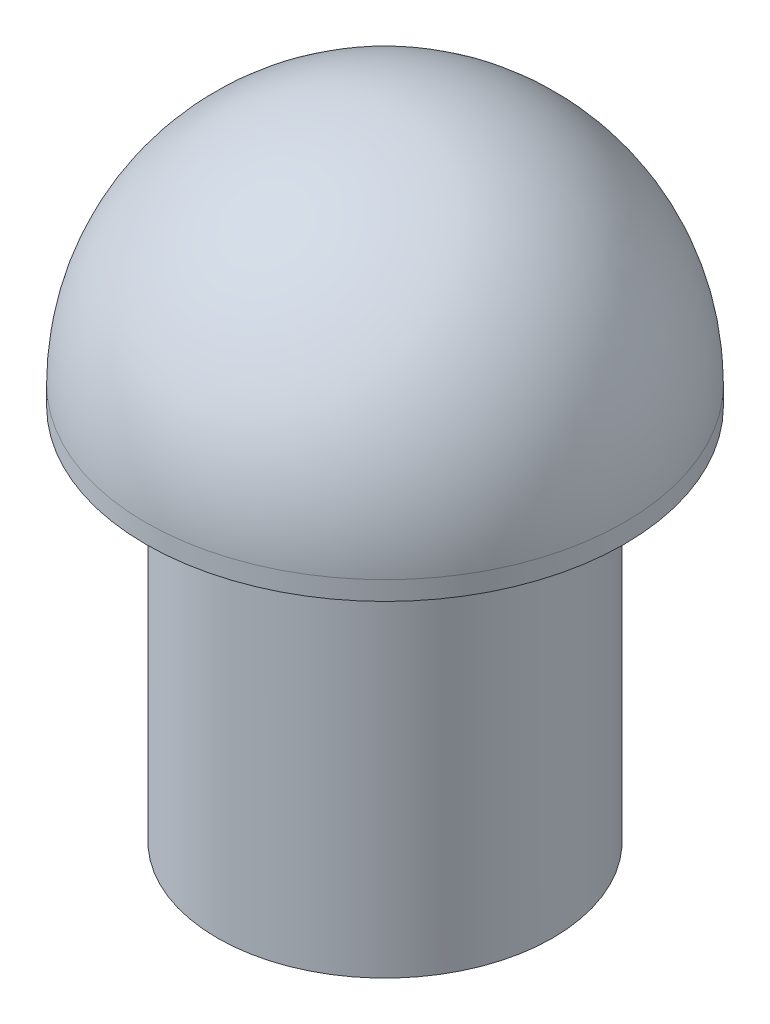
ISO-10303-21;
HEADER;
FILE_DESCRIPTION(('STEP AP214'),'2;1');
FILE_NAME('part.step','',(''),(''),'','','');
FILE_SCHEMA(('AUTOMOTIVE_DESIGN { 1 0 10303 214 1 1 1 1 }'));
ENDSEC;
DATA;
#1=APPLICATION_CONTEXT('core data for automotive mechanical design processes');
#2=APPLICATION_PROTOCOL_DEFINITION('international standard','automotive_design',2000,#1);
#3=PRODUCT_CONTEXT('',#1,'mechanical');
#4=PRODUCT('Part','Part','',(#3));
#5=PRODUCT_RELATED_PRODUCT_CATEGORY('part','',(#4));
#6=PRODUCT_DEFINITION_FORMATION('','',#4);
#7=PRODUCT_DEFINITION_CONTEXT('part definition',#1,'design');
#8=PRODUCT_DEFINITION('design','',#6,#7);
#9=PRODUCT_DEFINITION_SHAPE('','',#8);
#10=(LENGTH_UNIT() NAMED_UNIT(*) SI_UNIT(.MILLI.,.METRE.));
#11=(NAMED_UNIT(*) PLANE_ANGLE_UNIT() SI_UNIT($,.RADIAN.));
#12=(NAMED_UNIT(*) SI_UNIT($,.STERADIAN.) SOLID_ANGLE_UNIT());
#13=UNCERTAINTY_MEASURE_WITH_UNIT(LENGTH_MEASURE(1.E-05),#10,'distance_accuracy_value','');
#14=(GEOMETRIC_REPRESENTATION_CONTEXT(3) GLOBAL_UNCERTAINTY_ASSIGNED_CONTEXT((#13)) GLOBAL_UNIT_ASSIGNED_CONTEXT((#10,
#11,#12)) REPRESENTATION_CONTEXT('',''));
#15=CARTESIAN_POINT('',(0.,0.,0.));
#16=DIRECTION('',(0.,0.,1.));
#17=DIRECTION('',(1.,0.,0.));
#18=AXIS2_PLACEMENT_3D('',#15,#16,#17);
#19=CARTESIAN_POINT('',(0.,0.5,0.));
#20=DIRECTION('',(0.,-1.,0.));
#21=DIRECTION('',(0.,0.,-1.));
#22=AXIS2_PLACEMENT_3D('',#19,#20,#21);
#23=CYLINDRICAL_SURFACE('',#22,6.35);
#24=CARTESIAN_POINT('',(0.,0.5,0.));
#25=DIRECTION('',(0.,1.,0.));
#26=DIRECTION('',(0.,0.,1.));
#27=AXIS2_PLACEMENT_3D('',#24,#25,#26);
#28=CIRCLE('',#27,6.35);
#29=CARTESIAN_POINT('',(0.,0.5,6.35));
#30=VERTEX_POINT('',#29);
#31=EDGE_CURVE('E38',#30,#30,#28,.T.);
#32=ORIENTED_EDGE('',*,*,#31,.F.);
#33=EDGE_LOOP('',(#32));
#34=FACE_BOUND('',#33,.T.);
#35=CARTESIAN_POINT('',(0.,0.,0.));
#36=DIRECTION('',(0.,1.,0.));
#37=DIRECTION('',(0.,0.,1.));
#38=AXIS2_PLACEMENT_3D('',#35,#36,#37);
#39=CIRCLE('',#38,6.35);
#40=CARTESIAN_POINT('',(0.,0.,6.35));
#41=VERTEX_POINT('',#40);
#42=EDGE_CURVE('E42',#41,#41,#39,.T.);
#43=ORIENTED_EDGE('',*,*,#42,.T.);
#44=EDGE_LOOP('',(#43));
#45=FACE_BOUND('',#44,.T.);
#46=ADVANCED_FACE('F31',(#34,#45),#23,.T.);
#47=CARTESIAN_POINT('',(0.,0.5,0.));
#48=DIRECTION('',(0.,0.,1.));
#49=DIRECTION('',(1.,0.,0.));
#50=AXIS2_PLACEMENT_3D('',#47,#48,#49);
#51=SPHERICAL_SURFACE('',#50,6.35);
#52=CARTESIAN_POINT('',(0.,0.5,0.));
#53=DIRECTION('',(0.,1.,0.));
#54=DIRECTION('',(0.,0.,1.));
#55=AXIS2_PLACEMENT_3D('',#52,#53,#54);
#56=SPHERICAL_SURFACE('',#55,6.35);
#57=ORIENTED_EDGE('',*,*,#31,.T.);
#58=EDGE_LOOP('',(#57));
#59=FACE_BOUND('',#58,.T.);
#60=ADVANCED_FACE('F33',(#59),#56,.T.);
#61=CARTESIAN_POINT('',(0.,0.,0.));
#62=DIRECTION('',(0.,1.,0.));
#63=DIRECTION('',(0.,0.,1.));
#64=AXIS2_PLACEMENT_3D('',#61,#62,#63);
#65=PLANE('',#64);
#66=CARTESIAN_POINT('',(0.,0.,0.));
#67=DIRECTION('',(0.,1.,0.));
#68=DIRECTION('',(0.,0.,1.));
#69=AXIS2_PLACEMENT_3D('',#66,#67,#68);
#70=CIRCLE('',#69,4.45);
#71=CARTESIAN_POINT('',(0.,0.,4.45));
#72=VERTEX_POINT('',#71);
#73=EDGE_CURVE('E10',#72,#72,#70,.F.);
#74=ORIENTED_EDGE('',*,*,#73,.F.);
#75=EDGE_LOOP('',(#74));
#76=FACE_BOUND('',#75,.T.);
#77=ORIENTED_EDGE('',*,*,#42,.F.);
#78=EDGE_LOOP('',(#77));
#79=FACE_BOUND('',#78,.T.);
#80=ADVANCED_FACE('F64',(#76,#79),#65,.F.);
#81=CARTESIAN_POINT('',(0.,-10.,0.));
#82=DIRECTION('',(0.,-1.,0.));
#83=DIRECTION('',(0.,0.,-1.));
#84=AXIS2_PLACEMENT_3D('',#81,#82,#83);
#85=PLANE('',#84);
#86=CARTESIAN_POINT('',(0.,-10.,0.));
#87=DIRECTION('',(0.,-1.,0.));
#88=DIRECTION('',(0.,0.,-1.));
#89=AXIS2_PLACEMENT_3D('',#86,#87,#88);
#90=CIRCLE('',#89,4.45);
#91=CARTESIAN_POINT('',(0.,-10.,-4.45));
#92=VERTEX_POINT('',#91);
#93=EDGE_CURVE('E46',#92,#92,#90,.T.);
#94=ORIENTED_EDGE('',*,*,#93,.T.);
#95=EDGE_LOOP('',(#94));
#96=FACE_BOUND('',#95,.T.);
#97=CARTESIAN_POINT('',(0.,-10.,0.));
#98=DIRECTION('',(0.,-1.,0.));
#99=DIRECTION('',(0.,0.,-1.));
#100=AXIS2_PLACEMENT_3D('',#97,#98,#99);
#101=CIRCLE('',#100,3.);
#102=CARTESIAN_POINT('',(0.,-10.,-3.));
#103=VERTEX_POINT('',#102);
#104=EDGE_CURVE('E51',#103,#103,#101,.T.);
#105=ORIENTED_EDGE('',*,*,#104,.F.);
#106=EDGE_LOOP('',(#105));
#107=FACE_BOUND('',#106,.T.);
#108=ADVANCED_FACE('F61',(#96,#107),#85,.T.);
#109=CARTESIAN_POINT('',(0.,-10.,0.));
#110=DIRECTION('',(0.,1.,0.));
#111=DIRECTION('',(0.,0.,1.));
#112=AXIS2_PLACEMENT_3D('',#109,#110,#111);
#113=CYLINDRICAL_SURFACE('',#112,4.45);
#114=ORIENTED_EDGE('',*,*,#93,.F.);
#115=EDGE_LOOP('',(#114));
#116=FACE_BOUND('',#115,.T.);
#117=ORIENTED_EDGE('',*,*,#73,.T.);
#118=EDGE_LOOP('',(#117));
#119=FACE_BOUND('',#118,.T.);
#120=ADVANCED_FACE('F63',(#116,#119),#113,.T.);
#121=CARTESIAN_POINT('',(0.,-10.,0.));
#122=DIRECTION('',(0.,1.,0.));
#123=DIRECTION('',(0.,0.,1.));
#124=AXIS2_PLACEMENT_3D('',#121,#122,#123);
#125=CYLINDRICAL_SURFACE('',#124,3.);
#126=ORIENTED_EDGE('',*,*,#104,.T.);
#127=EDGE_LOOP('',(#126));
#128=FACE_BOUND('',#127,.T.);
#129=CARTESIAN_POINT('',(0.,0.,0.));
#130=DIRECTION('',(0.,-1.,0.));
#131=DIRECTION('',(0.,0.,-1.));
#132=AXIS2_PLACEMENT_3D('',#129,#130,#131);
#133=CIRCLE('',#132,3.);
#134=CARTESIAN_POINT('',(0.,0.,-3.));
#135=VERTEX_POINT('',#134);
#136=EDGE_CURVE('E52',#135,#135,#133,.T.);
#137=ORIENTED_EDGE('',*,*,#136,.F.);
#138=EDGE_LOOP('',(#137));
#139=FACE_BOUND('',#138,.T.);
#140=ADVANCED_FACE('F58',(#128,#139),#125,.F.);
#141=ORIENTED_EDGE('',*,*,#136,.T.);
#142=EDGE_LOOP('',(#141));
#143=FACE_BOUND('',#142,.T.);
#144=ADVANCED_FACE('F75',(#143),#65,.F.);
#145=CLOSED_SHELL('',(#46,#60,#80,#108,#120,#140,#144));
#146=MANIFOLD_SOLID_BREP('B2',#145);
#147=ADVANCED_BREP_SHAPE_REPRESENTATION('',(#18,#146),#14);
#148=SHAPE_DEFINITION_REPRESENTATION(#9,#147);
ENDSEC;
END-ISO-10303-21;
